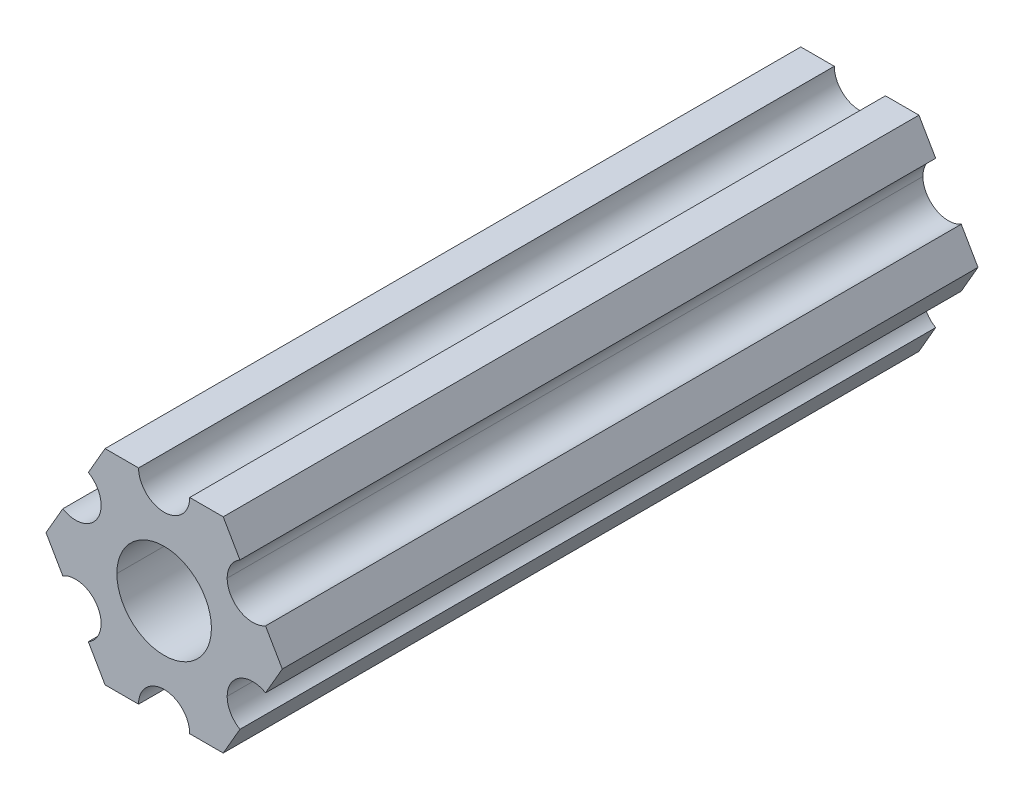
ISO-10303-21;
HEADER;
FILE_DESCRIPTION(('STEP AP214'),'2;1');
FILE_NAME('part.step','',(''),(''),'','','');
FILE_SCHEMA(('AUTOMOTIVE_DESIGN { 1 0 10303 214 1 1 1 1 }'));
ENDSEC;
DATA;
#1=APPLICATION_CONTEXT('core data for automotive mechanical design processes');
#2=APPLICATION_PROTOCOL_DEFINITION('international standard','automotive_design',2000,#1);
#3=PRODUCT_CONTEXT('',#1,'mechanical');
#4=PRODUCT('Part','Part','',(#3));
#5=PRODUCT_RELATED_PRODUCT_CATEGORY('part','',(#4));
#6=PRODUCT_DEFINITION_FORMATION('','',#4);
#7=PRODUCT_DEFINITION_CONTEXT('part definition',#1,'design');
#8=PRODUCT_DEFINITION('design','',#6,#7);
#9=PRODUCT_DEFINITION_SHAPE('','',#8);
#10=(LENGTH_UNIT() NAMED_UNIT(*) SI_UNIT(.MILLI.,.METRE.));
#11=(NAMED_UNIT(*) PLANE_ANGLE_UNIT() SI_UNIT($,.RADIAN.));
#12=(NAMED_UNIT(*) SI_UNIT($,.STERADIAN.) SOLID_ANGLE_UNIT());
#13=UNCERTAINTY_MEASURE_WITH_UNIT(LENGTH_MEASURE(1.E-05),#10,'distance_accuracy_value','');
#14=(GEOMETRIC_REPRESENTATION_CONTEXT(3) GLOBAL_UNCERTAINTY_ASSIGNED_CONTEXT((#13)) GLOBAL_UNIT_ASSIGNED_CONTEXT((#10,
#11,#12)) REPRESENTATION_CONTEXT('',''));
#15=CARTESIAN_POINT('',(0.,0.,0.));
#16=DIRECTION('',(0.,0.,1.));
#17=DIRECTION('',(1.,0.,0.));
#18=AXIS2_PLACEMENT_3D('',#15,#16,#17);
#19=CARTESIAN_POINT('',(0.,0.,304.8));
#20=DIRECTION('',(0.,0.,-1.));
#21=DIRECTION('',(-1.,0.,0.));
#22=AXIS2_PLACEMENT_3D('',#19,#20,#21);
#23=CYLINDRICAL_SURFACE('',#22,2.9337);
#24=CARTESIAN_POINT('',(0.,0.,43.18));
#25=DIRECTION('',(0.,0.,1.));
#26=DIRECTION('',(1.,0.,0.));
#27=AXIS2_PLACEMENT_3D('',#24,#25,#26);
#28=CIRCLE('',#27,2.9337);
#29=CARTESIAN_POINT('',(2.9337,0.,43.18));
#30=VERTEX_POINT('',#29);
#31=CARTESIAN_POINT('',(-2.9337,0.,43.18));
#32=VERTEX_POINT('',#31);
#33=EDGE_CURVE('E66',#30,#32,#28,.F.);
#34=ORIENTED_EDGE('',*,*,#33,.F.);
#35=DIRECTION('',(0.,0.,-1.));
#36=VECTOR('',#35,1.);
#37=CARTESIAN_POINT('',(2.9337,0.,304.8));
#38=LINE('',#37,#36);
#39=CARTESIAN_POINT('',(2.9337,0.,0.));
#40=VERTEX_POINT('',#39);
#41=EDGE_CURVE('E53',#30,#40,#38,.T.);
#42=ORIENTED_EDGE('',*,*,#41,.T.);
#43=CARTESIAN_POINT('',(0.,0.,0.));
#44=DIRECTION('',(0.,0.,1.));
#45=DIRECTION('',(1.,0.,0.));
#46=AXIS2_PLACEMENT_3D('',#43,#44,#45);
#47=CIRCLE('',#46,2.9337);
#48=CARTESIAN_POINT('',(-2.9337,0.,0.));
#49=VERTEX_POINT('',#48);
#50=EDGE_CURVE('E249',#49,#40,#47,.T.);
#51=ORIENTED_EDGE('',*,*,#50,.F.);
#52=DIRECTION('',(0.,0.,-1.));
#53=VECTOR('',#52,1.);
#54=CARTESIAN_POINT('',(-2.9337,0.,304.8));
#55=LINE('',#54,#53);
#56=EDGE_CURVE('E219',#32,#49,#55,.T.);
#57=ORIENTED_EDGE('',*,*,#56,.F.);
#58=EDGE_LOOP('',(#34,#42,#51,#57));
#59=FACE_BOUND('',#58,.T.);
#60=ADVANCED_FACE('F46',(#59),#23,.F.);
#61=CARTESIAN_POINT('',(5.49926150638082,-3.17499966684067,304.8));
#62=DIRECTION('',(0.,0.,-1.));
#63=DIRECTION('',(-1.,0.,0.));
#64=AXIS2_PLACEMENT_3D('',#61,#62,#63);
#65=CYLINDRICAL_SURFACE('',#64,1.5875);
#66=CARTESIAN_POINT('',(5.49926150638082,-3.17499966684067,43.18));
#67=DIRECTION('',(0.,0.,1.));
#68=DIRECTION('',(1.,0.,0.));
#69=AXIS2_PLACEMENT_3D('',#66,#67,#68);
#70=CIRCLE('',#69,1.5875);
#71=CARTESIAN_POINT('',(3.91176150638082,-3.17499966684067,43.18));
#72=VERTEX_POINT('',#71);
#73=CARTESIAN_POINT('',(6.29301142309098,-1.80018429024546,43.18));
#74=VERTEX_POINT('',#73);
#75=EDGE_CURVE('E373',#72,#74,#70,.F.);
#76=ORIENTED_EDGE('',*,*,#75,.F.);
#77=DIRECTION('',(0.,0.,-1.));
#78=VECTOR('',#77,1.);
#79=CARTESIAN_POINT('',(3.91176150638082,-3.17499966684067,304.8));
#80=LINE('',#79,#78);
#81=CARTESIAN_POINT('',(3.91176150638082,-3.17499966684067,0.));
#82=VERTEX_POINT('',#81);
#83=EDGE_CURVE('E226',#72,#82,#80,.T.);
#84=ORIENTED_EDGE('',*,*,#83,.T.);
#85=CARTESIAN_POINT('',(5.49926150638082,-3.17499966684067,0.));
#86=DIRECTION('',(0.,0.,-1.));
#87=DIRECTION('',(1.,0.,0.));
#88=AXIS2_PLACEMENT_3D('',#85,#86,#87);
#89=CIRCLE('',#88,1.5875);
#90=CARTESIAN_POINT('',(6.29301142309098,-1.80018429024546,0.));
#91=VERTEX_POINT('',#90);
#92=EDGE_CURVE('E228',#82,#91,#89,.T.);
#93=ORIENTED_EDGE('',*,*,#92,.T.);
#94=DIRECTION('',(0.,0.,-1.));
#95=VECTOR('',#94,1.);
#96=CARTESIAN_POINT('',(6.29301142309098,-1.80018429024546,304.8));
#97=LINE('',#96,#95);
#98=EDGE_CURVE('E354',#74,#91,#97,.T.);
#99=ORIENTED_EDGE('',*,*,#98,.F.);
#100=EDGE_LOOP('',(#76,#84,#93,#99));
#101=FACE_BOUND('',#100,.T.);
#102=ADVANCED_FACE('F409',(#101),#65,.F.);
#103=CARTESIAN_POINT('',(5.49926112168156,3.17500033315934,304.8));
#104=DIRECTION('',(0.,0.,-1.));
#105=DIRECTION('',(-1.,0.,0.));
#106=AXIS2_PLACEMENT_3D('',#103,#104,#105);
#107=CYLINDRICAL_SURFACE('',#106,1.5875);
#108=CARTESIAN_POINT('',(5.49926112168156,3.17500033315934,43.18));
#109=DIRECTION('',(0.,0.,1.));
#110=DIRECTION('',(1.,0.,0.));
#111=AXIS2_PLACEMENT_3D('',#108,#109,#110);
#112=CIRCLE('',#111,1.5875);
#113=CARTESIAN_POINT('',(3.91176112168156,3.17500033315934,43.18));
#114=VERTEX_POINT('',#113);
#115=CARTESIAN_POINT('',(4.70551103839172,4.54981561357972,43.18));
#116=VERTEX_POINT('',#115);
#117=EDGE_CURVE('E375',#114,#116,#112,.F.);
#118=ORIENTED_EDGE('',*,*,#117,.F.);
#119=DIRECTION('',(0.,0.,-1.));
#120=VECTOR('',#119,1.);
#121=CARTESIAN_POINT('',(3.91176112168156,3.17500033315934,304.8));
#122=LINE('',#121,#120);
#123=CARTESIAN_POINT('',(3.91176112168156,3.17500033315934,0.));
#124=VERTEX_POINT('',#123);
#125=EDGE_CURVE('E248',#114,#124,#122,.T.);
#126=ORIENTED_EDGE('',*,*,#125,.T.);
#127=CARTESIAN_POINT('',(5.49926112168156,3.17500033315934,0.));
#128=DIRECTION('',(0.,0.,-1.));
#129=DIRECTION('',(1.,0.,0.));
#130=AXIS2_PLACEMENT_3D('',#127,#128,#129);
#131=CIRCLE('',#130,1.5875);
#132=CARTESIAN_POINT('',(4.70551103839172,4.54981561357972,0.));
#133=VERTEX_POINT('',#132);
#134=EDGE_CURVE('E244',#124,#133,#131,.T.);
#135=ORIENTED_EDGE('',*,*,#134,.T.);
#136=DIRECTION('',(0.,0.,-1.));
#137=VECTOR('',#136,1.);
#138=CARTESIAN_POINT('',(4.70551103839172,4.54981561357972,304.8));
#139=LINE('',#138,#137);
#140=EDGE_CURVE('E287',#116,#133,#139,.T.);
#141=ORIENTED_EDGE('',*,*,#140,.F.);
#142=EDGE_LOOP('',(#118,#126,#135,#141));
#143=FACE_BOUND('',#142,.T.);
#144=ADVANCED_FACE('F483',(#143),#107,.F.);
#145=CARTESIAN_POINT('',(6.29301142309098,-1.80018429024546,304.8));
#146=DIRECTION('',(-0.866025434075723,0.499999947533953,0.));
#147=DIRECTION('',(0.,0.,1.));
#148=AXIS2_PLACEMENT_3D('',#145,#146,#147);
#149=PLANE('',#148);
#150=DIRECTION('',(0.499999947533953,0.866025434075723,0.));
#151=VECTOR('',#150,1.);
#152=CARTESIAN_POINT('',(6.29301142309098,-1.80018429024546,43.18));
#153=LINE('',#152,#151);
#154=CARTESIAN_POINT('',(7.33234841870827,4.44212519169686E-07,43.18));
#155=VERTEX_POINT('',#154);
#156=EDGE_CURVE('E293',#74,#155,#153,.T.);
#157=ORIENTED_EDGE('',*,*,#156,.F.);
#158=ORIENTED_EDGE('',*,*,#98,.T.);
#159=DIRECTION('',(0.499999947533953,0.866025434075723,0.));
#160=VECTOR('',#159,1.);
#161=CARTESIAN_POINT('',(6.29301142309098,-1.80018429024546,0.));
#162=LINE('',#161,#160);
#163=CARTESIAN_POINT('',(7.33234841870827,4.44212519169686E-07,0.));
#164=VERTEX_POINT('',#163);
#165=EDGE_CURVE('E252',#91,#164,#162,.T.);
#166=ORIENTED_EDGE('',*,*,#165,.T.);
#167=DIRECTION('',(0.,0.,-1.));
#168=VECTOR('',#167,1.);
#169=CARTESIAN_POINT('',(7.33234841870827,4.44212519169686E-07,304.8));
#170=LINE('',#169,#168);
#171=EDGE_CURVE('E259',#155,#164,#170,.T.);
#172=ORIENTED_EDGE('',*,*,#171,.F.);
#173=EDGE_LOOP('',(#157,#158,#166,#172));
#174=FACE_BOUND('',#173,.T.);
#175=ADVANCED_FACE('F492',(#174),#149,.F.);
#176=CARTESIAN_POINT('',(7.33234841870827,4.44212519169686E-07,304.8));
#177=DIRECTION('',(-0.866025373493145,-0.500000052466057,0.));
#178=DIRECTION('',(-0.500000052466057,0.866025373493145,0.));
#179=AXIS2_PLACEMENT_3D('',#176,#177,#178);
#180=PLANE('',#179);
#181=DIRECTION('',(-0.500000052466057,0.866025373493145,0.));
#182=VECTOR('',#181,1.);
#183=CARTESIAN_POINT('',(7.33234841870827,4.44212519169686E-07,43.18));
#184=LINE('',#183,#182);
#185=CARTESIAN_POINT('',(6.29301120497139,1.80018505273895,43.18));
#186=VERTEX_POINT('',#185);
#187=EDGE_CURVE('E369',#155,#186,#184,.T.);
#188=ORIENTED_EDGE('',*,*,#187,.F.);
#189=ORIENTED_EDGE('',*,*,#171,.T.);
#190=DIRECTION('',(-0.500000052466056,0.866025373493145,0.));
#191=VECTOR('',#190,1.);
#192=CARTESIAN_POINT('',(7.33234841870827,4.44212519169686E-07,0.));
#193=LINE('',#192,#191);
#194=CARTESIAN_POINT('',(6.29301120497139,1.80018505273894,0.));
#195=VERTEX_POINT('',#194);
#196=EDGE_CURVE('E342',#164,#195,#193,.T.);
#197=ORIENTED_EDGE('',*,*,#196,.T.);
#198=DIRECTION('',(0.,0.,-1.));
#199=VECTOR('',#198,1.);
#200=CARTESIAN_POINT('',(6.29301120497139,1.80018505273894,304.8));
#201=LINE('',#200,#199);
#202=EDGE_CURVE('E257',#186,#195,#201,.T.);
#203=ORIENTED_EDGE('',*,*,#202,.F.);
#204=EDGE_LOOP('',(#188,#189,#197,#203));
#205=FACE_BOUND('',#204,.T.);
#206=ADVANCED_FACE('F490',(#205),#180,.F.);
#207=CARTESIAN_POINT('',(5.49926112168156,3.17500033315934,304.8));
#208=DIRECTION('',(0.,0.,-1.));
#209=DIRECTION('',(-1.,0.,0.));
#210=AXIS2_PLACEMENT_3D('',#207,#208,#209);
#211=CYLINDRICAL_SURFACE('',#210,1.5875);
#212=CARTESIAN_POINT('',(5.49926112168156,3.17500033315934,43.18));
#213=DIRECTION('',(0.,0.,1.));
#214=DIRECTION('',(1.,0.,0.));
#215=AXIS2_PLACEMENT_3D('',#212,#213,#214);
#216=CIRCLE('',#215,1.5875);
#217=EDGE_CURVE('E371',#186,#114,#216,.F.);
#218=ORIENTED_EDGE('',*,*,#217,.F.);
#219=ORIENTED_EDGE('',*,*,#202,.T.);
#220=CARTESIAN_POINT('',(5.49926112168156,3.17500033315934,0.));
#221=DIRECTION('',(0.,0.,-1.));
#222=DIRECTION('',(1.,0.,0.));
#223=AXIS2_PLACEMENT_3D('',#220,#221,#222);
#224=CIRCLE('',#223,1.5875);
#225=EDGE_CURVE('E260',#195,#124,#224,.T.);
#226=ORIENTED_EDGE('',*,*,#225,.T.);
#227=ORIENTED_EDGE('',*,*,#125,.F.);
#228=EDGE_LOOP('',(#218,#219,#226,#227));
#229=FACE_BOUND('',#228,.T.);
#230=ADVANCED_FACE('F488',(#229),#211,.F.);
#231=CARTESIAN_POINT('',(4.70551103839172,4.54981561357972,304.8));
#232=DIRECTION('',(-0.866025373493151,-0.500000052466046,0.));
#233=DIRECTION('',(-0.500000052466046,0.866025373493151,0.));
#234=AXIS2_PLACEMENT_3D('',#231,#232,#233);
#235=PLANE('',#234);
#236=DIRECTION('',(-0.500000052466046,0.866025373493151,0.));
#237=VECTOR('',#236,1.);
#238=CARTESIAN_POINT('',(4.70551103839172,4.54981561357972,43.18));
#239=LINE('',#238,#237);
#240=CARTESIAN_POINT('',(3.66617382465481,6.35000022210627,43.18));
#241=VERTEX_POINT('',#240);
#242=EDGE_CURVE('E377',#116,#241,#239,.T.);
#243=ORIENTED_EDGE('',*,*,#242,.F.);
#244=ORIENTED_EDGE('',*,*,#140,.T.);
#245=DIRECTION('',(-0.500000052466046,0.866025373493151,0.));
#246=VECTOR('',#245,1.);
#247=CARTESIAN_POINT('',(4.70551103839172,4.54981561357972,0.));
#248=LINE('',#247,#246);
#249=CARTESIAN_POINT('',(3.66617382465481,6.35000022210627,0.));
#250=VERTEX_POINT('',#249);
#251=EDGE_CURVE('E306',#133,#250,#248,.T.);
#252=ORIENTED_EDGE('',*,*,#251,.T.);
#253=DIRECTION('',(0.,0.,-1.));
#254=VECTOR('',#253,1.);
#255=CARTESIAN_POINT('',(3.66617382465481,6.35000022210627,304.8));
#256=LINE('',#255,#254);
#257=EDGE_CURVE('E288',#241,#250,#256,.T.);
#258=ORIENTED_EDGE('',*,*,#257,.F.);
#259=EDGE_LOOP('',(#243,#244,#252,#258));
#260=FACE_BOUND('',#259,.T.);
#261=ADVANCED_FACE('F479',(#260),#235,.F.);
#262=CARTESIAN_POINT('',(3.66617382465481,6.35000022210627,304.8));
#263=DIRECTION('',(6.05825850611185E-08,-1.,0.));
#264=DIRECTION('',(0.,0.,-1.));
#265=AXIS2_PLACEMENT_3D('',#262,#263,#264);
#266=PLANE('',#265);
#267=DIRECTION('',(-0.999999999999998,-6.05825850611184E-08,0.));
#268=VECTOR('',#267,1.);
#269=CARTESIAN_POINT('',(3.66617382465481,6.35000022210627,43.18));
#270=LINE('',#269,#268);
#271=CARTESIAN_POINT('',(1.58749961530074,6.35,43.18));
#272=VERTEX_POINT('',#271);
#273=EDGE_CURVE('E379',#241,#272,#270,.T.);
#274=ORIENTED_EDGE('',*,*,#273,.F.);
#275=ORIENTED_EDGE('',*,*,#257,.T.);
#276=DIRECTION('',(-1.,-6.05825850611185E-08,0.));
#277=VECTOR('',#276,1.);
#278=CARTESIAN_POINT('',(3.66617382465481,6.35000022210627,0.));
#279=LINE('',#278,#277);
#280=CARTESIAN_POINT('',(1.58749961530074,6.35000009617482,0.));
#281=VERTEX_POINT('',#280);
#282=EDGE_CURVE('E283',#250,#281,#279,.T.);
#283=ORIENTED_EDGE('',*,*,#282,.T.);
#284=DIRECTION('',(0.,0.,-1.));
#285=VECTOR('',#284,1.);
#286=CARTESIAN_POINT('',(1.58749961530074,6.35000009617482,304.8));
#287=LINE('',#286,#285);
#288=EDGE_CURVE('E261',#272,#281,#287,.T.);
#289=ORIENTED_EDGE('',*,*,#288,.F.);
#290=EDGE_LOOP('',(#274,#275,#283,#289));
#291=FACE_BOUND('',#290,.T.);
#292=ADVANCED_FACE('F473',(#291),#266,.F.);
#293=CARTESIAN_POINT('',(-3.84699260060323E-07,6.35,304.8));
#294=DIRECTION('',(0.,0.,-1.));
#295=DIRECTION('',(-1.,0.,0.));
#296=AXIS2_PLACEMENT_3D('',#293,#294,#295);
#297=CYLINDRICAL_SURFACE('',#296,1.5875);
#298=CARTESIAN_POINT('',(-3.84699260060323E-07,6.35,43.18));
#299=DIRECTION('',(0.,0.,1.));
#300=DIRECTION('',(1.,0.,0.));
#301=AXIS2_PLACEMENT_3D('',#298,#299,#300);
#302=CIRCLE('',#301,1.5875);
#303=CARTESIAN_POINT('',(-1.58750038469926,6.34999990382518,43.18));
#304=VERTEX_POINT('',#303);
#305=EDGE_CURVE('E381',#272,#304,#302,.F.);
#306=ORIENTED_EDGE('',*,*,#305,.F.);
#307=ORIENTED_EDGE('',*,*,#288,.T.);
#308=CARTESIAN_POINT('',(-3.84699260060323E-07,6.35,0.));
#309=DIRECTION('',(0.,0.,-1.));
#310=DIRECTION('',(1.,0.,0.));
#311=AXIS2_PLACEMENT_3D('',#308,#309,#310);
#312=CIRCLE('',#311,1.5875);
#313=CARTESIAN_POINT('',(-1.58750038469926,6.34999990382519,0.));
#314=VERTEX_POINT('',#313);
#315=EDGE_CURVE('E263',#281,#314,#312,.T.);
#316=ORIENTED_EDGE('',*,*,#315,.T.);
#317=DIRECTION('',(0.,0.,-1.));
#318=VECTOR('',#317,1.);
#319=CARTESIAN_POINT('',(-1.58750038469926,6.34999990382519,304.8));
#320=LINE('',#319,#318);
#321=EDGE_CURVE('E300',#304,#314,#320,.T.);
#322=ORIENTED_EDGE('',*,*,#321,.F.);
#323=EDGE_LOOP('',(#306,#307,#316,#322));
#324=FACE_BOUND('',#323,.T.);
#325=ADVANCED_FACE('F469',(#324),#297,.F.);
#326=CARTESIAN_POINT('',(-1.58750038469926,6.34999990382518,304.8));
#327=DIRECTION('',(6.05825963273174E-08,-1.,0.));
#328=DIRECTION('',(0.,0.,-1.));
#329=AXIS2_PLACEMENT_3D('',#326,#327,#328);
#330=PLANE('',#329);
#331=DIRECTION('',(-0.999999999999998,-6.05825963273173E-08,0.));
#332=VECTOR('',#331,1.);
#333=CARTESIAN_POINT('',(-1.58750038469926,6.34999990382518,43.18));
#334=LINE('',#333,#332);
#335=CARTESIAN_POINT('',(-3.66617459405349,6.3499997778937,43.18));
#336=VERTEX_POINT('',#335);
#337=EDGE_CURVE('E383',#304,#336,#334,.T.);
#338=ORIENTED_EDGE('',*,*,#337,.F.);
#339=ORIENTED_EDGE('',*,*,#321,.T.);
#340=DIRECTION('',(-1.,-6.05825963273174E-08,0.));
#341=VECTOR('',#340,1.);
#342=CARTESIAN_POINT('',(-1.58750038469926,6.34999990382518,0.));
#343=LINE('',#342,#341);
#344=CARTESIAN_POINT('',(-3.66617459405349,6.3499997778937,0.));
#345=VERTEX_POINT('',#344);
#346=EDGE_CURVE('E264',#314,#345,#343,.T.);
#347=ORIENTED_EDGE('',*,*,#346,.T.);
#348=DIRECTION('',(0.,0.,-1.));
#349=VECTOR('',#348,1.);
#350=CARTESIAN_POINT('',(-3.66617459405349,6.3499997778937,304.8));
#351=LINE('',#350,#349);
#352=EDGE_CURVE('E279',#336,#345,#351,.T.);
#353=ORIENTED_EDGE('',*,*,#352,.F.);
#354=EDGE_LOOP('',(#338,#339,#347,#353));
#355=FACE_BOUND('',#354,.T.);
#356=ADVANCED_FACE('F511',(#355),#330,.F.);
#357=CARTESIAN_POINT('',(-3.66617459405349,6.3499997778937,304.8));
#358=DIRECTION('',(0.866025434075729,-0.499999947533942,0.));
#359=DIRECTION('',(0.,0.,-1.));
#360=AXIS2_PLACEMENT_3D('',#357,#358,#359);
#361=PLANE('',#360);
#362=DIRECTION('',(-0.499999947533942,-0.866025434075729,0.));
#363=VECTOR('',#362,1.);
#364=CARTESIAN_POINT('',(-3.66617459405349,6.3499997778937,43.18));
#365=LINE('',#364,#363);
#366=CARTESIAN_POINT('',(-4.70551158967065,4.54981504343587,43.18));
#367=VERTEX_POINT('',#366);
#368=EDGE_CURVE('E385',#336,#367,#365,.T.);
#369=ORIENTED_EDGE('',*,*,#368,.F.);
#370=ORIENTED_EDGE('',*,*,#352,.T.);
#371=DIRECTION('',(-0.499999947533943,-0.866025434075729,0.));
#372=VECTOR('',#371,1.);
#373=CARTESIAN_POINT('',(-3.66617459405349,6.3499997778937,0.));
#374=LINE('',#373,#372);
#375=CARTESIAN_POINT('',(-4.70551158967065,4.54981504343587,0.));
#376=VERTEX_POINT('',#375);
#377=EDGE_CURVE('E281',#345,#376,#374,.T.);
#378=ORIENTED_EDGE('',*,*,#377,.T.);
#379=DIRECTION('',(0.,0.,-1.));
#380=VECTOR('',#379,1.);
#381=CARTESIAN_POINT('',(-4.70551158967065,4.54981504343587,304.8));
#382=LINE('',#381,#380);
#383=EDGE_CURVE('E256',#367,#376,#382,.T.);
#384=ORIENTED_EDGE('',*,*,#383,.F.);
#385=EDGE_LOOP('',(#369,#370,#378,#384));
#386=FACE_BOUND('',#385,.T.);
#387=ADVANCED_FACE('F464',(#386),#361,.F.);
#388=CARTESIAN_POINT('',(-5.49926150638082,3.17499966684067,304.8));
#389=DIRECTION('',(0.,0.,-1.));
#390=DIRECTION('',(-1.,0.,0.));
#391=AXIS2_PLACEMENT_3D('',#388,#389,#390);
#392=CYLINDRICAL_SURFACE('',#391,1.5875);
#393=CARTESIAN_POINT('',(-5.49926150638082,3.17499966684067,43.18));
#394=DIRECTION('',(0.,0.,1.));
#395=DIRECTION('',(1.,0.,0.));
#396=AXIS2_PLACEMENT_3D('',#393,#394,#395);
#397=CIRCLE('',#396,1.5875);
#398=CARTESIAN_POINT('',(-6.29301142309098,1.80018429024547,43.18));
#399=VERTEX_POINT('',#398);
#400=EDGE_CURVE('E387',#367,#399,#397,.F.);
#401=ORIENTED_EDGE('',*,*,#400,.F.);
#402=ORIENTED_EDGE('',*,*,#383,.T.);
#403=CARTESIAN_POINT('',(-5.49926150638082,3.17499966684067,0.));
#404=DIRECTION('',(0.,0.,-1.));
#405=DIRECTION('',(1.,0.,0.));
#406=AXIS2_PLACEMENT_3D('',#403,#404,#405);
#407=CIRCLE('',#406,1.5875);
#408=CARTESIAN_POINT('',(-6.29301142309098,1.80018429024547,0.));
#409=VERTEX_POINT('',#408);
#410=EDGE_CURVE('E282',#376,#409,#407,.T.);
#411=ORIENTED_EDGE('',*,*,#410,.T.);
#412=DIRECTION('',(0.,0.,-1.));
#413=VECTOR('',#412,1.);
#414=CARTESIAN_POINT('',(-6.29301142309098,1.80018429024547,304.8));
#415=LINE('',#414,#413);
#416=EDGE_CURVE('E232',#399,#409,#415,.T.);
#417=ORIENTED_EDGE('',*,*,#416,.F.);
#418=EDGE_LOOP('',(#401,#402,#411,#417));
#419=FACE_BOUND('',#418,.T.);
#420=ADVANCED_FACE('F460',(#419),#392,.F.);
#421=CARTESIAN_POINT('',(-6.29301142309098,1.80018429024547,304.8));
#422=DIRECTION('',(0.866025434075724,-0.499999947533952,0.));
#423=DIRECTION('',(0.,0.,-1.));
#424=AXIS2_PLACEMENT_3D('',#421,#422,#423);
#425=PLANE('',#424);
#426=DIRECTION('',(-0.499999947533952,-0.866025434075724,0.));
#427=VECTOR('',#426,1.);
#428=CARTESIAN_POINT('',(-6.29301142309098,1.80018429024547,43.18));
#429=LINE('',#428,#427);
#430=CARTESIAN_POINT('',(-7.33234841870827,-4.44212523790841E-07,43.18));
#431=VERTEX_POINT('',#430);
#432=EDGE_CURVE('E389',#399,#431,#429,.T.);
#433=ORIENTED_EDGE('',*,*,#432,.F.);
#434=ORIENTED_EDGE('',*,*,#416,.T.);
#435=DIRECTION('',(-0.499999947533951,-0.866025434075724,0.));
#436=VECTOR('',#435,1.);
#437=CARTESIAN_POINT('',(-6.29301142309098,1.80018429024547,0.));
#438=LINE('',#437,#436);
#439=CARTESIAN_POINT('',(-7.33234841870827,-4.44212523790841E-07,0.));
#440=VERTEX_POINT('',#439);
#441=EDGE_CURVE('E234',#409,#440,#438,.T.);
#442=ORIENTED_EDGE('',*,*,#441,.T.);
#443=DIRECTION('',(0.,0.,-1.));
#444=VECTOR('',#443,1.);
#445=CARTESIAN_POINT('',(-7.33234841870827,-4.44212523790841E-07,304.8));
#446=LINE('',#445,#444);
#447=EDGE_CURVE('E265',#431,#440,#446,.T.);
#448=ORIENTED_EDGE('',*,*,#447,.F.);
#449=EDGE_LOOP('',(#433,#434,#442,#448));
#450=FACE_BOUND('',#449,.T.);
#451=ADVANCED_FACE('F454',(#450),#425,.F.);
#452=CARTESIAN_POINT('',(-7.33234841870827,-4.44212523790841E-07,304.8));
#453=DIRECTION('',(0.866025373493151,0.500000052466045,0.));
#454=DIRECTION('',(0.,0.,-1.));
#455=AXIS2_PLACEMENT_3D('',#452,#453,#454);
#456=PLANE('',#455);
#457=DIRECTION('',(0.500000052466045,-0.866025373493151,0.));
#458=VECTOR('',#457,1.);
#459=CARTESIAN_POINT('',(-7.33234841870827,-4.44212523790841E-07,43.18));
#460=LINE('',#459,#458);
#461=CARTESIAN_POINT('',(-6.29301120497141,-1.80018505273896,43.18));
#462=VERTEX_POINT('',#461);
#463=EDGE_CURVE('E391',#431,#462,#460,.T.);
#464=ORIENTED_EDGE('',*,*,#463,.F.);
#465=ORIENTED_EDGE('',*,*,#447,.T.);
#466=DIRECTION('',(0.500000052466045,-0.866025373493151,0.));
#467=VECTOR('',#466,1.);
#468=CARTESIAN_POINT('',(-7.33234841870827,-4.44212523790841E-07,0.));
#469=LINE('',#468,#467);
#470=CARTESIAN_POINT('',(-6.29301120497141,-1.80018505273897,0.));
#471=VERTEX_POINT('',#470);
#472=EDGE_CURVE('E235',#440,#471,#469,.T.);
#473=ORIENTED_EDGE('',*,*,#472,.T.);
#474=DIRECTION('',(0.,0.,-1.));
#475=VECTOR('',#474,1.);
#476=CARTESIAN_POINT('',(-6.29301120497141,-1.80018505273897,304.8));
#477=LINE('',#476,#475);
#478=EDGE_CURVE('E243',#462,#471,#477,.T.);
#479=ORIENTED_EDGE('',*,*,#478,.F.);
#480=EDGE_LOOP('',(#464,#465,#473,#479));
#481=FACE_BOUND('',#480,.T.);
#482=ADVANCED_FACE('F450',(#481),#456,.F.);
#483=CARTESIAN_POINT('',(-5.49926112168156,-3.17500033315934,304.8));
#484=DIRECTION('',(0.,0.,-1.));
#485=DIRECTION('',(-1.,0.,0.));
#486=AXIS2_PLACEMENT_3D('',#483,#484,#485);
#487=CYLINDRICAL_SURFACE('',#486,1.5875);
#488=CARTESIAN_POINT('',(-5.49926112168156,-3.17500033315934,43.18));
#489=DIRECTION('',(0.,0.,1.));
#490=DIRECTION('',(1.,0.,0.));
#491=AXIS2_PLACEMENT_3D('',#488,#489,#490);
#492=CIRCLE('',#491,1.5875);
#493=CARTESIAN_POINT('',(-4.70551103839172,-4.54981561357972,43.18));
#494=VERTEX_POINT('',#493);
#495=EDGE_CURVE('E393',#462,#494,#492,.F.);
#496=ORIENTED_EDGE('',*,*,#495,.F.);
#497=ORIENTED_EDGE('',*,*,#478,.T.);
#498=CARTESIAN_POINT('',(-5.49926112168156,-3.17500033315934,0.));
#499=DIRECTION('',(0.,0.,-1.));
#500=DIRECTION('',(1.,0.,0.));
#501=AXIS2_PLACEMENT_3D('',#498,#499,#500);
#502=CIRCLE('',#501,1.5875);
#503=CARTESIAN_POINT('',(-4.70551103839172,-4.54981561357972,0.));
#504=VERTEX_POINT('',#503);
#505=EDGE_CURVE('E267',#471,#504,#502,.T.);
#506=ORIENTED_EDGE('',*,*,#505,.T.);
#507=DIRECTION('',(0.,0.,-1.));
#508=VECTOR('',#507,1.);
#509=CARTESIAN_POINT('',(-4.70551103839172,-4.54981561357972,304.8));
#510=LINE('',#509,#508);
#511=EDGE_CURVE('E236',#494,#504,#510,.T.);
#512=ORIENTED_EDGE('',*,*,#511,.F.);
#513=EDGE_LOOP('',(#496,#497,#506,#512));
#514=FACE_BOUND('',#513,.T.);
#515=ADVANCED_FACE('F444',(#514),#487,.F.);
#516=CARTESIAN_POINT('',(-4.70551103839172,-4.54981561357972,304.8));
#517=DIRECTION('',(0.866025373493152,0.500000052466045,0.));
#518=DIRECTION('',(0.,0.,-1.));
#519=AXIS2_PLACEMENT_3D('',#516,#517,#518);
#520=PLANE('',#519);
#521=DIRECTION('',(0.500000052466045,-0.866025373493152,0.));
#522=VECTOR('',#521,1.);
#523=CARTESIAN_POINT('',(-4.70551103839172,-4.54981561357972,43.18));
#524=LINE('',#523,#522);
#525=CARTESIAN_POINT('',(-3.66617382465481,-6.35000022210628,43.18));
#526=VERTEX_POINT('',#525);
#527=EDGE_CURVE('E395',#494,#526,#524,.T.);
#528=ORIENTED_EDGE('',*,*,#527,.F.);
#529=ORIENTED_EDGE('',*,*,#511,.T.);
#530=DIRECTION('',(0.500000052466045,-0.866025373493152,0.));
#531=VECTOR('',#530,1.);
#532=CARTESIAN_POINT('',(-4.70551103839172,-4.54981561357972,0.));
#533=LINE('',#532,#531);
#534=CARTESIAN_POINT('',(-3.66617382465481,-6.35000022210628,0.));
#535=VERTEX_POINT('',#534);
#536=EDGE_CURVE('E238',#504,#535,#533,.T.);
#537=ORIENTED_EDGE('',*,*,#536,.T.);
#538=DIRECTION('',(0.,0.,-1.));
#539=VECTOR('',#538,1.);
#540=CARTESIAN_POINT('',(-3.66617382465481,-6.35000022210628,304.8));
#541=LINE('',#540,#539);
#542=EDGE_CURVE('E340',#526,#535,#541,.T.);
#543=ORIENTED_EDGE('',*,*,#542,.F.);
#544=EDGE_LOOP('',(#528,#529,#537,#543));
#545=FACE_BOUND('',#544,.T.);
#546=ADVANCED_FACE('F440',(#545),#520,.F.);
#547=CARTESIAN_POINT('',(-3.66617382465481,-6.35000022210628,304.8));
#548=DIRECTION('',(-6.05825854783851E-08,1.,0.));
#549=DIRECTION('',(0.,0.,1.));
#550=AXIS2_PLACEMENT_3D('',#547,#548,#549);
#551=PLANE('',#550);
#552=DIRECTION('',(0.999999999999998,6.0582585478385E-08,0.));
#553=VECTOR('',#552,1.);
#554=CARTESIAN_POINT('',(-3.66617382465481,-6.35000022210628,43.18));
#555=LINE('',#554,#553);
#556=CARTESIAN_POINT('',(-1.58749961530073,-6.35000009617482,43.18));
#557=VERTEX_POINT('',#556);
#558=EDGE_CURVE('E397',#526,#557,#555,.T.);
#559=ORIENTED_EDGE('',*,*,#558,.F.);
#560=ORIENTED_EDGE('',*,*,#542,.T.);
#561=DIRECTION('',(1.,6.05825854783851E-08,0.));
#562=VECTOR('',#561,1.);
#563=CARTESIAN_POINT('',(-3.66617382465481,-6.35000022210628,0.));
#564=LINE('',#563,#562);
#565=CARTESIAN_POINT('',(-1.58749961530073,-6.35000009617482,0.));
#566=VERTEX_POINT('',#565);
#567=EDGE_CURVE('E239',#535,#566,#564,.T.);
#568=ORIENTED_EDGE('',*,*,#567,.T.);
#569=DIRECTION('',(0.,0.,-1.));
#570=VECTOR('',#569,1.);
#571=CARTESIAN_POINT('',(-1.58749961530073,-6.35000009617482,304.8));
#572=LINE('',#571,#570);
#573=EDGE_CURVE('E305',#557,#566,#572,.T.);
#574=ORIENTED_EDGE('',*,*,#573,.F.);
#575=EDGE_LOOP('',(#559,#560,#568,#574));
#576=FACE_BOUND('',#575,.T.);
#577=ADVANCED_FACE('F434',(#576),#551,.F.);
#578=CARTESIAN_POINT('',(3.8469926204343E-07,-6.35,304.8));
#579=DIRECTION('',(0.,0.,-1.));
#580=DIRECTION('',(-1.,0.,0.));
#581=AXIS2_PLACEMENT_3D('',#578,#579,#580);
#582=CYLINDRICAL_SURFACE('',#581,1.5875);
#583=CARTESIAN_POINT('',(3.8469926204343E-07,-6.35,43.18));
#584=DIRECTION('',(0.,0.,1.));
#585=DIRECTION('',(1.,0.,0.));
#586=AXIS2_PLACEMENT_3D('',#583,#584,#585);
#587=CIRCLE('',#586,1.5875);
#588=CARTESIAN_POINT('',(1.58750038469926,-6.34999990382518,43.18));
#589=VERTEX_POINT('',#588);
#590=EDGE_CURVE('E399',#557,#589,#587,.F.);
#591=ORIENTED_EDGE('',*,*,#590,.F.);
#592=ORIENTED_EDGE('',*,*,#573,.T.);
#593=CARTESIAN_POINT('',(3.8469926204343E-07,-6.35,0.));
#594=DIRECTION('',(0.,0.,-1.));
#595=DIRECTION('',(1.,0.,0.));
#596=AXIS2_PLACEMENT_3D('',#593,#594,#595);
#597=CIRCLE('',#596,1.5875);
#598=CARTESIAN_POINT('',(1.58750038469926,-6.34999990382518,0.));
#599=VERTEX_POINT('',#598);
#600=EDGE_CURVE('E336',#566,#599,#597,.T.);
#601=ORIENTED_EDGE('',*,*,#600,.T.);
#602=DIRECTION('',(0.,0.,-1.));
#603=VECTOR('',#602,1.);
#604=CARTESIAN_POINT('',(1.58750038469926,-6.34999990382518,304.8));
#605=LINE('',#604,#603);
#606=EDGE_CURVE('E273',#589,#599,#605,.T.);
#607=ORIENTED_EDGE('',*,*,#606,.F.);
#608=EDGE_LOOP('',(#591,#592,#601,#607));
#609=FACE_BOUND('',#608,.T.);
#610=ADVANCED_FACE('F430',(#609),#582,.F.);
#611=CARTESIAN_POINT('',(1.58750038469926,-6.34999990382518,304.8));
#612=DIRECTION('',(-6.05825721258438E-08,1.,0.));
#613=DIRECTION('',(0.,0.,1.));
#614=AXIS2_PLACEMENT_3D('',#611,#612,#613);
#615=PLANE('',#614);
#616=DIRECTION('',(0.999999999999998,6.05825721258437E-08,0.));
#617=VECTOR('',#616,1.);
#618=CARTESIAN_POINT('',(1.58750038469926,-6.34999990382518,43.18));
#619=LINE('',#618,#617);
#620=CARTESIAN_POINT('',(3.66617459405346,-6.34999977789375,43.18));
#621=VERTEX_POINT('',#620);
#622=EDGE_CURVE('E401',#589,#621,#619,.T.);
#623=ORIENTED_EDGE('',*,*,#622,.F.);
#624=ORIENTED_EDGE('',*,*,#606,.T.);
#625=DIRECTION('',(1.,6.05825721258438E-08,0.));
#626=VECTOR('',#625,1.);
#627=CARTESIAN_POINT('',(1.58750038469926,-6.34999990382518,0.));
#628=LINE('',#627,#626);
#629=CARTESIAN_POINT('',(3.66617459405346,-6.34999977789375,0.));
#630=VERTEX_POINT('',#629);
#631=EDGE_CURVE('E301',#599,#630,#628,.T.);
#632=ORIENTED_EDGE('',*,*,#631,.T.);
#633=DIRECTION('',(0.,0.,-1.));
#634=VECTOR('',#633,1.);
#635=CARTESIAN_POINT('',(3.66617459405346,-6.34999977789375,304.8));
#636=LINE('',#635,#634);
#637=EDGE_CURVE('E274',#621,#630,#636,.T.);
#638=ORIENTED_EDGE('',*,*,#637,.F.);
#639=EDGE_LOOP('',(#623,#624,#632,#638));
#640=FACE_BOUND('',#639,.T.);
#641=ADVANCED_FACE('F424',(#640),#615,.F.);
#642=CARTESIAN_POINT('',(3.66617459405346,-6.34999977789375,304.8));
#643=DIRECTION('',(-0.86602543407573,0.499999947533941,0.));
#644=DIRECTION('',(0.,0.,1.));
#645=AXIS2_PLACEMENT_3D('',#642,#643,#644);
#646=PLANE('',#645);
#647=DIRECTION('',(0.499999947533941,0.86602543407573,0.));
#648=VECTOR('',#647,1.);
#649=CARTESIAN_POINT('',(3.66617459405346,-6.34999977789375,43.18));
#650=LINE('',#649,#648);
#651=CARTESIAN_POINT('',(4.70551158967065,-4.54981504343587,43.18));
#652=VERTEX_POINT('',#651);
#653=EDGE_CURVE('E60',#621,#652,#650,.T.);
#654=ORIENTED_EDGE('',*,*,#653,.F.);
#655=ORIENTED_EDGE('',*,*,#637,.T.);
#656=DIRECTION('',(0.499999947533941,0.86602543407573,0.));
#657=VECTOR('',#656,1.);
#658=CARTESIAN_POINT('',(3.66617459405346,-6.34999977789375,0.));
#659=LINE('',#658,#657);
#660=CARTESIAN_POINT('',(4.70551158967065,-4.54981504343587,0.));
#661=VERTEX_POINT('',#660);
#662=EDGE_CURVE('E269',#630,#661,#659,.T.);
#663=ORIENTED_EDGE('',*,*,#662,.T.);
#664=DIRECTION('',(0.,0.,-1.));
#665=VECTOR('',#664,1.);
#666=CARTESIAN_POINT('',(4.70551158967065,-4.54981504343587,304.8));
#667=LINE('',#666,#665);
#668=EDGE_CURVE('E275',#652,#661,#667,.T.);
#669=ORIENTED_EDGE('',*,*,#668,.F.);
#670=EDGE_LOOP('',(#654,#655,#663,#669));
#671=FACE_BOUND('',#670,.T.);
#672=ADVANCED_FACE('F420',(#671),#646,.F.);
#673=CARTESIAN_POINT('',(5.49926150638082,-3.17499966684067,304.8));
#674=DIRECTION('',(0.,0.,-1.));
#675=DIRECTION('',(-1.,0.,0.));
#676=AXIS2_PLACEMENT_3D('',#673,#674,#675);
#677=CYLINDRICAL_SURFACE('',#676,1.5875);
#678=CARTESIAN_POINT('',(5.49926150638082,-3.17499966684067,43.18));
#679=DIRECTION('',(0.,0.,1.));
#680=DIRECTION('',(1.,0.,0.));
#681=AXIS2_PLACEMENT_3D('',#678,#679,#680);
#682=CIRCLE('',#681,1.5875);
#683=EDGE_CURVE('E220',#652,#72,#682,.F.);
#684=ORIENTED_EDGE('',*,*,#683,.F.);
#685=ORIENTED_EDGE('',*,*,#668,.T.);
#686=CARTESIAN_POINT('',(5.49926150638082,-3.17499966684067,0.));
#687=DIRECTION('',(0.,0.,-1.));
#688=DIRECTION('',(1.,0.,0.));
#689=AXIS2_PLACEMENT_3D('',#686,#687,#688);
#690=CIRCLE('',#689,1.5875);
#691=EDGE_CURVE('E277',#661,#82,#690,.T.);
#692=ORIENTED_EDGE('',*,*,#691,.T.);
#693=ORIENTED_EDGE('',*,*,#83,.F.);
#694=EDGE_LOOP('',(#684,#685,#692,#693));
#695=FACE_BOUND('',#694,.T.);
#696=ADVANCED_FACE('F411',(#695),#677,.F.);
#697=CARTESIAN_POINT('',(0.,0.,304.8));
#698=DIRECTION('',(0.,0.,-1.));
#699=DIRECTION('',(-1.,0.,0.));
#700=AXIS2_PLACEMENT_3D('',#697,#698,#699);
#701=CYLINDRICAL_SURFACE('',#700,2.9337);
#702=CARTESIAN_POINT('',(0.,0.,43.18));
#703=DIRECTION('',(0.,0.,1.));
#704=DIRECTION('',(1.,0.,0.));
#705=AXIS2_PLACEMENT_3D('',#702,#703,#704);
#706=CIRCLE('',#705,2.9337);
#707=EDGE_CURVE('E12',#32,#30,#706,.F.);
#708=ORIENTED_EDGE('',*,*,#707,.F.);
#709=ORIENTED_EDGE('',*,*,#56,.T.);
#710=CARTESIAN_POINT('',(0.,0.,0.));
#711=DIRECTION('',(0.,0.,1.));
#712=DIRECTION('',(1.,0.,0.));
#713=AXIS2_PLACEMENT_3D('',#710,#711,#712);
#714=CIRCLE('',#713,2.9337);
#715=EDGE_CURVE('E225',#40,#49,#714,.T.);
#716=ORIENTED_EDGE('',*,*,#715,.F.);
#717=ORIENTED_EDGE('',*,*,#41,.F.);
#718=EDGE_LOOP('',(#708,#709,#716,#717));
#719=FACE_BOUND('',#718,.T.);
#720=ADVANCED_FACE('F223',(#719),#701,.F.);
#721=CARTESIAN_POINT('',(5.49926112168156,3.17500033315934,0.));
#722=DIRECTION('',(0.,0.,1.));
#723=DIRECTION('',(1.,0.,0.));
#724=AXIS2_PLACEMENT_3D('',#721,#722,#723);
#725=PLANE('',#724);
#726=ORIENTED_EDGE('',*,*,#165,.F.);
#727=ORIENTED_EDGE('',*,*,#92,.F.);
#728=ORIENTED_EDGE('',*,*,#691,.F.);
#729=ORIENTED_EDGE('',*,*,#662,.F.);
#730=ORIENTED_EDGE('',*,*,#631,.F.);
#731=ORIENTED_EDGE('',*,*,#600,.F.);
#732=ORIENTED_EDGE('',*,*,#567,.F.);
#733=ORIENTED_EDGE('',*,*,#536,.F.);
#734=ORIENTED_EDGE('',*,*,#505,.F.);
#735=ORIENTED_EDGE('',*,*,#472,.F.);
#736=ORIENTED_EDGE('',*,*,#441,.F.);
#737=ORIENTED_EDGE('',*,*,#410,.F.);
#738=ORIENTED_EDGE('',*,*,#377,.F.);
#739=ORIENTED_EDGE('',*,*,#346,.F.);
#740=ORIENTED_EDGE('',*,*,#315,.F.);
#741=ORIENTED_EDGE('',*,*,#282,.F.);
#742=ORIENTED_EDGE('',*,*,#251,.F.);
#743=ORIENTED_EDGE('',*,*,#134,.F.);
#744=ORIENTED_EDGE('',*,*,#225,.F.);
#745=ORIENTED_EDGE('',*,*,#196,.F.);
#746=EDGE_LOOP('',(#726,#727,#728,#729,#730,#731,#732,#733,#734,#735,#736,#737,#738,#739,#740,
#741,#742,#743,#744,#745));
#747=FACE_BOUND('',#746,.T.);
#748=ORIENTED_EDGE('',*,*,#50,.T.);
#749=ORIENTED_EDGE('',*,*,#715,.T.);
#750=EDGE_LOOP('',(#748,#749));
#751=FACE_BOUND('',#750,.T.);
#752=ADVANCED_FACE('F416',(#747,#751),#725,.F.);
#753=CARTESIAN_POINT('',(5.49926112168156,3.17500033315934,43.18));
#754=DIRECTION('',(0.,0.,1.));
#755=DIRECTION('',(1.,0.,0.));
#756=AXIS2_PLACEMENT_3D('',#753,#754,#755);
#757=PLANE('',#756);
#758=ORIENTED_EDGE('',*,*,#33,.T.);
#759=ORIENTED_EDGE('',*,*,#707,.T.);
#760=EDGE_LOOP('',(#758,#759));
#761=FACE_BOUND('',#760,.T.);
#762=ORIENTED_EDGE('',*,*,#156,.T.);
#763=ORIENTED_EDGE('',*,*,#187,.T.);
#764=ORIENTED_EDGE('',*,*,#217,.T.);
#765=ORIENTED_EDGE('',*,*,#117,.T.);
#766=ORIENTED_EDGE('',*,*,#242,.T.);
#767=ORIENTED_EDGE('',*,*,#273,.T.);
#768=ORIENTED_EDGE('',*,*,#305,.T.);
#769=ORIENTED_EDGE('',*,*,#337,.T.);
#770=ORIENTED_EDGE('',*,*,#368,.T.);
#771=ORIENTED_EDGE('',*,*,#400,.T.);
#772=ORIENTED_EDGE('',*,*,#432,.T.);
#773=ORIENTED_EDGE('',*,*,#463,.T.);
#774=ORIENTED_EDGE('',*,*,#495,.T.);
#775=ORIENTED_EDGE('',*,*,#527,.T.);
#776=ORIENTED_EDGE('',*,*,#558,.T.);
#777=ORIENTED_EDGE('',*,*,#590,.T.);
#778=ORIENTED_EDGE('',*,*,#622,.T.);
#779=ORIENTED_EDGE('',*,*,#653,.T.);
#780=ORIENTED_EDGE('',*,*,#683,.T.);
#781=ORIENTED_EDGE('',*,*,#75,.T.);
#782=EDGE_LOOP('',(#762,#763,#764,#765,#766,#767,#768,#769,#770,#771,#772,#773,#774,#775,#776,
#777,#778,#779,#780,#781));
#783=FACE_BOUND('',#782,.T.);
#784=ADVANCED_FACE('F212',(#761,#783),#757,.T.);
#785=CLOSED_SHELL('',(#60,#102,#144,#175,#206,#230,#261,#292,#325,#356,#387,#420,#451,#482,#515,
#546,#577,#610,#641,#672,#696,#720,#752,#784));
#786=MANIFOLD_SOLID_BREP('B2',#785);
#787=ADVANCED_BREP_SHAPE_REPRESENTATION('',(#18,#786),#14);
#788=SHAPE_DEFINITION_REPRESENTATION(#9,#787);
ENDSEC;
END-ISO-10303-21;
